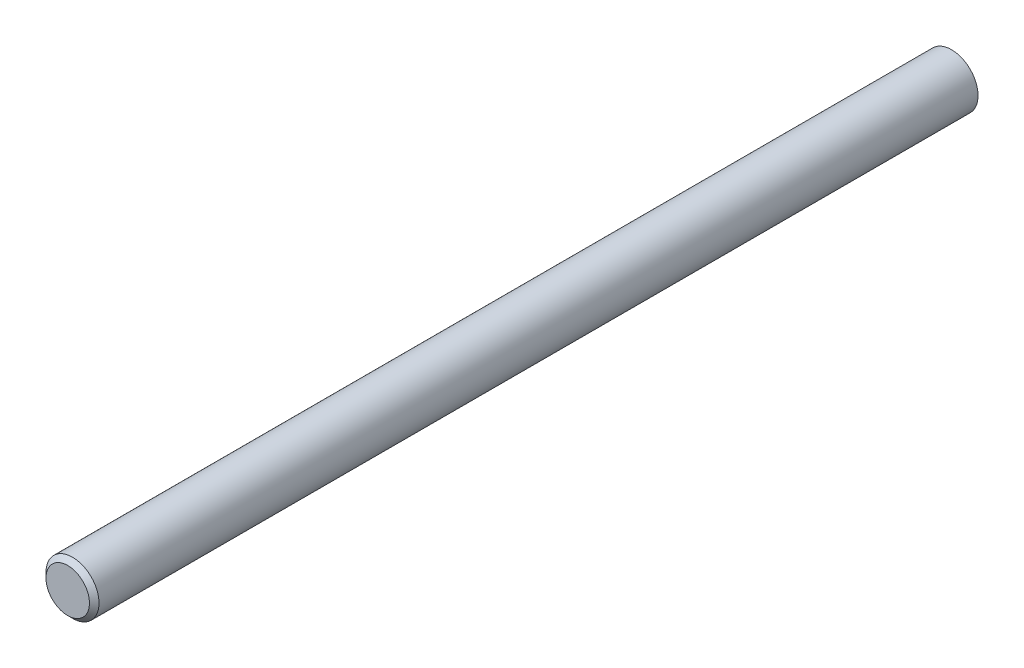
ISO-10303-21;
HEADER;
FILE_DESCRIPTION(('STEP AP214'),'2;1');
FILE_NAME('part.step','',(''),(''),'','','');
FILE_SCHEMA(('AUTOMOTIVE_DESIGN { 1 0 10303 214 1 1 1 1 }'));
ENDSEC;
DATA;
#1=APPLICATION_CONTEXT('core data for automotive mechanical design processes');
#2=APPLICATION_PROTOCOL_DEFINITION('international standard','automotive_design',2000,#1);
#3=PRODUCT_CONTEXT('',#1,'mechanical');
#4=PRODUCT('Part','Part','',(#3));
#5=PRODUCT_RELATED_PRODUCT_CATEGORY('part','',(#4));
#6=PRODUCT_DEFINITION_FORMATION('','',#4);
#7=PRODUCT_DEFINITION_CONTEXT('part definition',#1,'design');
#8=PRODUCT_DEFINITION('design','',#6,#7);
#9=PRODUCT_DEFINITION_SHAPE('','',#8);
#10=(LENGTH_UNIT() NAMED_UNIT(*) SI_UNIT(.MILLI.,.METRE.));
#11=(NAMED_UNIT(*) PLANE_ANGLE_UNIT() SI_UNIT($,.RADIAN.));
#12=(NAMED_UNIT(*) SI_UNIT($,.STERADIAN.) SOLID_ANGLE_UNIT());
#13=UNCERTAINTY_MEASURE_WITH_UNIT(LENGTH_MEASURE(1.E-05),#10,'distance_accuracy_value','');
#14=(GEOMETRIC_REPRESENTATION_CONTEXT(3) GLOBAL_UNCERTAINTY_ASSIGNED_CONTEXT((#13)) GLOBAL_UNIT_ASSIGNED_CONTEXT((#10,
#11,#12)) REPRESENTATION_CONTEXT('',''));
#15=CARTESIAN_POINT('',(0.,0.,0.));
#16=DIRECTION('',(0.,0.,1.));
#17=DIRECTION('',(1.,0.,0.));
#18=AXIS2_PLACEMENT_3D('',#15,#16,#17);
#19=CARTESIAN_POINT('',(0.,0.,100.));
#20=DIRECTION('',(0.,0.,-1.));
#21=DIRECTION('',(-1.,0.,0.));
#22=AXIS2_PLACEMENT_3D('',#19,#20,#21);
#23=CYLINDRICAL_SURFACE('',#22,3.);
#24=CARTESIAN_POINT('',(0.,0.,99.4585));
#25=DIRECTION('',(0.,0.,-1.));
#26=DIRECTION('',(-1.,0.,0.));
#27=AXIS2_PLACEMENT_3D('',#24,#25,#26);
#28=CIRCLE('',#27,3.);
#29=CARTESIAN_POINT('',(-3.,0.,99.4585));
#30=VERTEX_POINT('',#29);
#31=EDGE_CURVE('E56',#30,#30,#28,.T.);
#32=CARTESIAN_POINT('',(0.,0.,0.));
#33=DIRECTION('',(0.,0.,1.));
#34=DIRECTION('',(1.,0.,0.));
#35=AXIS2_PLACEMENT_3D('',#32,#33,#34);
#36=CIRCLE('',#35,3.);
#37=CARTESIAN_POINT('',(-3.,0.,0.));
#38=VERTEX_POINT('',#37);
#39=EDGE_CURVE('E10',#38,#38,#36,.T.);
#40=CARTESIAN_POINT('',(-3.,0.,99.4585));
#41=CARTESIAN_POINT('',(-3.,0.,98.4224739583333));
#42=CARTESIAN_POINT('',(-3.,0.,97.3864479166667));
#43=CARTESIAN_POINT('',(-3.,0.,95.3143958333333));
#44=CARTESIAN_POINT('',(-3.,0.,94.2783697916667));
#45=CARTESIAN_POINT('',(-3.,0.,92.2063177083333));
#46=CARTESIAN_POINT('',(-3.,0.,91.1702916666667));
#47=CARTESIAN_POINT('',(-3.,0.,89.0982395833333));
#48=CARTESIAN_POINT('',(-3.,0.,88.0622135416667));
#49=CARTESIAN_POINT('',(-3.,0.,85.9901614583333));
#50=CARTESIAN_POINT('',(-3.,0.,84.9541354166667));
#51=CARTESIAN_POINT('',(-3.,0.,82.8820833333333));
#52=CARTESIAN_POINT('',(-3.,0.,81.8460572916667));
#53=CARTESIAN_POINT('',(-3.,0.,79.7740052083333));
#54=CARTESIAN_POINT('',(-3.,0.,78.7379791666667));
#55=CARTESIAN_POINT('',(-3.,0.,76.6659270833333));
#56=CARTESIAN_POINT('',(-3.,0.,75.6299010416667));
#57=CARTESIAN_POINT('',(-3.,0.,73.5578489583333));
#58=CARTESIAN_POINT('',(-3.,0.,72.5218229166667));
#59=CARTESIAN_POINT('',(-3.,0.,70.4497708333333));
#60=CARTESIAN_POINT('',(-3.,0.,69.4137447916667));
#61=CARTESIAN_POINT('',(-3.,0.,67.3416927083333));
#62=CARTESIAN_POINT('',(-3.,0.,66.3056666666667));
#63=CARTESIAN_POINT('',(-3.,0.,64.2336145833333));
#64=CARTESIAN_POINT('',(-3.,0.,63.1975885416667));
#65=CARTESIAN_POINT('',(-3.,0.,61.1255364583333));
#66=CARTESIAN_POINT('',(-3.,0.,60.0895104166667));
#67=CARTESIAN_POINT('',(-3.,0.,58.0174583333333));
#68=CARTESIAN_POINT('',(-3.,0.,56.9814322916667));
#69=CARTESIAN_POINT('',(-3.,0.,54.9093802083333));
#70=CARTESIAN_POINT('',(-3.,0.,53.8733541666667));
#71=CARTESIAN_POINT('',(-3.,0.,51.8013020833333));
#72=CARTESIAN_POINT('',(-3.,0.,50.7652760416667));
#73=CARTESIAN_POINT('',(-3.,0.,48.6932239583333));
#74=CARTESIAN_POINT('',(-3.,0.,47.6571979166667));
#75=CARTESIAN_POINT('',(-3.,0.,45.5851458333333));
#76=CARTESIAN_POINT('',(-3.,0.,44.5491197916667));
#77=CARTESIAN_POINT('',(-3.,0.,42.4770677083333));
#78=CARTESIAN_POINT('',(-3.,0.,41.4410416666667));
#79=CARTESIAN_POINT('',(-3.,0.,39.3689895833333));
#80=CARTESIAN_POINT('',(-3.,0.,38.3329635416667));
#81=CARTESIAN_POINT('',(-3.,0.,36.2609114583333));
#82=CARTESIAN_POINT('',(-3.,0.,35.2248854166667));
#83=CARTESIAN_POINT('',(-3.,0.,33.1528333333333));
#84=CARTESIAN_POINT('',(-3.,0.,32.1168072916667));
#85=CARTESIAN_POINT('',(-3.,0.,30.0447552083333));
#86=CARTESIAN_POINT('',(-3.,0.,29.0087291666667));
#87=CARTESIAN_POINT('',(-3.,0.,26.9366770833333));
#88=CARTESIAN_POINT('',(-3.,0.,25.9006510416667));
#89=CARTESIAN_POINT('',(-3.,0.,23.8285989583333));
#90=CARTESIAN_POINT('',(-3.,0.,22.7925729166667));
#91=CARTESIAN_POINT('',(-3.,0.,20.7205208333333));
#92=CARTESIAN_POINT('',(-3.,0.,19.6844947916667));
#93=CARTESIAN_POINT('',(-3.,0.,17.6124427083333));
#94=CARTESIAN_POINT('',(-3.,0.,16.5764166666667));
#95=CARTESIAN_POINT('',(-3.,0.,14.5043645833333));
#96=CARTESIAN_POINT('',(-3.,0.,13.4683385416667));
#97=CARTESIAN_POINT('',(-3.,0.,11.3962864583333));
#98=CARTESIAN_POINT('',(-3.,0.,10.3602604166667));
#99=CARTESIAN_POINT('',(-3.,0.,8.28820833333333));
#100=CARTESIAN_POINT('',(-3.,0.,7.25218229166666));
#101=CARTESIAN_POINT('',(-3.,0.,5.18013020833333));
#102=CARTESIAN_POINT('',(-3.,0.,4.14410416666666));
#103=CARTESIAN_POINT('',(-3.,0.,2.07205208333333));
#104=CARTESIAN_POINT('',(-3.,0.,1.03602604166666));
#105=CARTESIAN_POINT('',(-3.,0.,0.));
#106=B_SPLINE_CURVE_WITH_KNOTS('',3,(#40,#41,#42,#43,#44,#45,#46,#47,#48,#49,#50,#51,#52,#53,
#54,#55,#56,#57,#58,#59,#60,#61,#62,#63,#64,#65,#66,#67,#68,#69,#70,#71,#72,#73,#74,#75,#76,#77,
#78,#79,#80,#81,#82,#83,#84,#85,#86,#87,#88,#89,#90,#91,#92,#93,#94,#95,#96,#97,#98,#99,#100,
#101,#102,#103,#104,#105),.UNSPECIFIED.,.F.,.F.,(4,2,2,2,2,2,2,2,2,2,2,2,2,2,2,2,2,2,2,2,2,2,2,
2,2,2,2,2,2,2,2,2,4),(0.,3.108078125,6.21615624999999,9.32423437499999,12.4323125,15.540390625,
18.64846875,21.756546875,24.864625,27.972703125,31.08078125,34.188859375,37.2969375,
40.405015625,43.51309375,46.621171875,49.72925,52.837328125,55.94540625,59.053484375,62.1615625,
65.269640625,68.37771875,71.485796875,74.593875,77.701953125,80.81003125,83.918109375,
87.0261875,90.134265625,93.24234375,96.350421875,99.4585),.UNSPECIFIED.);
#107=EDGE_CURVE('BSEAM49',#30,#38,#106,.T.);
#108=ORIENTED_EDGE('',*,*,#31,.T.);
#109=ORIENTED_EDGE('',*,*,#39,.T.);
#110=ORIENTED_EDGE('',*,*,#107,.T.);
#111=ORIENTED_EDGE('',*,*,#107,.F.);
#112=EDGE_LOOP('',(#108,#110,#109,#111));
#113=FACE_BOUND('',#112,.T.);
#114=ADVANCED_FACE('F49',(#113),#23,.T.);
#115=CARTESIAN_POINT('',(0.,0.,0.));
#116=DIRECTION('',(0.,0.,1.));
#117=DIRECTION('',(1.,0.,0.));
#118=AXIS2_PLACEMENT_3D('',#115,#116,#117);
#119=PLANE('',#118);
#120=ORIENTED_EDGE('',*,*,#39,.F.);
#121=EDGE_LOOP('',(#120));
#122=FACE_BOUND('',#121,.T.);
#123=ADVANCED_FACE('F77',(#122),#119,.F.);
#124=CARTESIAN_POINT('',(0.,0.,100.));
#125=DIRECTION('',(0.,0.,-1.));
#126=DIRECTION('',(-1.,0.,0.));
#127=AXIS2_PLACEMENT_3D('',#124,#125,#126);
#128=CONICAL_SURFACE('',#127,2.4585,0.785398163397451);
#129=ORIENTED_EDGE('',*,*,#31,.F.);
#130=EDGE_LOOP('',(#129));
#131=FACE_BOUND('',#130,.T.);
#132=CARTESIAN_POINT('',(0.,0.,100.));
#133=DIRECTION('',(0.,0.,-1.));
#134=DIRECTION('',(-1.,0.,0.));
#135=AXIS2_PLACEMENT_3D('',#132,#133,#134);
#136=CIRCLE('',#135,2.4585);
#137=CARTESIAN_POINT('',(-2.4585,0.,100.));
#138=VERTEX_POINT('',#137);
#139=EDGE_CURVE('E61',#138,#138,#136,.T.);
#140=ORIENTED_EDGE('',*,*,#139,.T.);
#141=EDGE_LOOP('',(#140));
#142=FACE_BOUND('',#141,.T.);
#143=ADVANCED_FACE('F69',(#131,#142),#128,.T.);
#144=CARTESIAN_POINT('',(0.,0.,100.));
#145=DIRECTION('',(0.,0.,1.));
#146=DIRECTION('',(1.,0.,0.));
#147=AXIS2_PLACEMENT_3D('',#144,#145,#146);
#148=PLANE('',#147);
#149=ORIENTED_EDGE('',*,*,#139,.F.);
#150=EDGE_LOOP('',(#149));
#151=FACE_BOUND('',#150,.T.);
#152=ADVANCED_FACE('F71',(#151),#148,.T.);
#153=CLOSED_SHELL('',(#114,#123,#143,#152));
#154=MANIFOLD_SOLID_BREP('B2',#153);
#155=ADVANCED_BREP_SHAPE_REPRESENTATION('',(#18,#154),#14);
#156=SHAPE_DEFINITION_REPRESENTATION(#9,#155);
ENDSEC;
END-ISO-10303-21;
